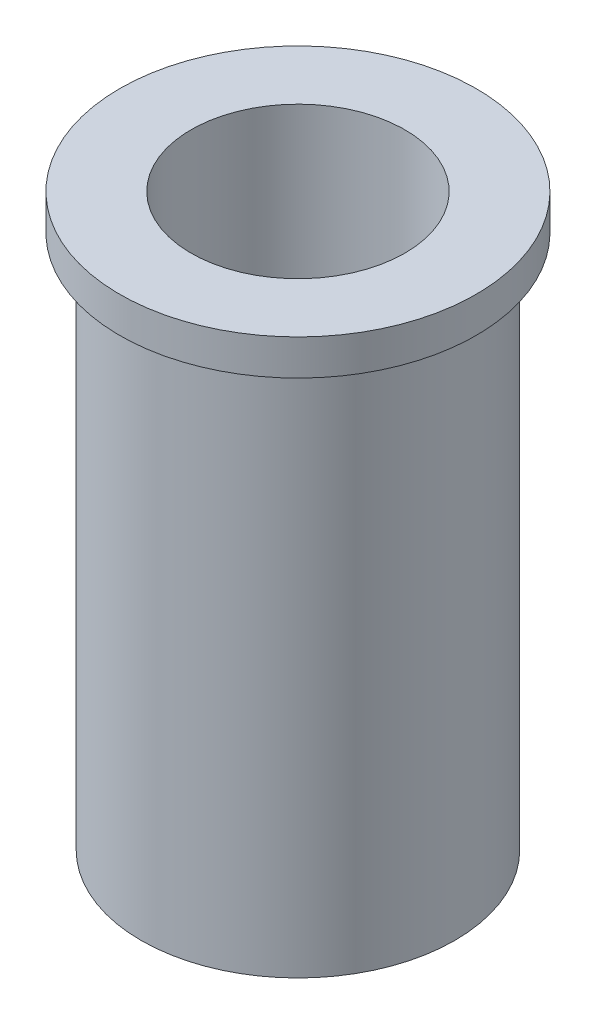
ISO-10303-21;
HEADER;
FILE_DESCRIPTION(('STEP AP214'),'2;1');
FILE_NAME('part.step','',(''),(''),'','','');
FILE_SCHEMA(('AUTOMOTIVE_DESIGN { 1 0 10303 214 1 1 1 1 }'));
ENDSEC;
DATA;
#1=APPLICATION_CONTEXT('core data for automotive mechanical design processes');
#2=APPLICATION_PROTOCOL_DEFINITION('international standard','automotive_design',2000,#1);
#3=PRODUCT_CONTEXT('',#1,'mechanical');
#4=PRODUCT('Part','Part','',(#3));
#5=PRODUCT_RELATED_PRODUCT_CATEGORY('part','',(#4));
#6=PRODUCT_DEFINITION_FORMATION('','',#4);
#7=PRODUCT_DEFINITION_CONTEXT('part definition',#1,'design');
#8=PRODUCT_DEFINITION('design','',#6,#7);
#9=PRODUCT_DEFINITION_SHAPE('','',#8);
#10=(LENGTH_UNIT() NAMED_UNIT(*) SI_UNIT(.MILLI.,.METRE.));
#11=(NAMED_UNIT(*) PLANE_ANGLE_UNIT() SI_UNIT($,.RADIAN.));
#12=(NAMED_UNIT(*) SI_UNIT($,.STERADIAN.) SOLID_ANGLE_UNIT());
#13=UNCERTAINTY_MEASURE_WITH_UNIT(LENGTH_MEASURE(1.E-05),#10,'distance_accuracy_value','');
#14=(GEOMETRIC_REPRESENTATION_CONTEXT(3) GLOBAL_UNCERTAINTY_ASSIGNED_CONTEXT((#13)) GLOBAL_UNIT_ASSIGNED_CONTEXT((#10,
#11,#12)) REPRESENTATION_CONTEXT('',''));
#15=CARTESIAN_POINT('',(0.,0.,0.));
#16=DIRECTION('',(0.,0.,1.));
#17=DIRECTION('',(1.,0.,0.));
#18=AXIS2_PLACEMENT_3D('',#15,#16,#17);
#19=CARTESIAN_POINT('',(0.,2.87205778568436,0.));
#20=DIRECTION('',(0.,1.,0.));
#21=DIRECTION('',(-1.,0.,0.));
#22=AXIS2_PLACEMENT_3D('',#19,#20,#21);
#23=CYLINDRICAL_SURFACE('',#22,5.);
#24=CARTESIAN_POINT('',(0.,1.87205778568436,0.));
#25=DIRECTION('',(0.,1.,0.));
#26=DIRECTION('',(-1.,0.,0.));
#27=AXIS2_PLACEMENT_3D('',#24,#25,#26);
#28=CIRCLE('',#27,5.);
#29=CARTESIAN_POINT('',(-5.,1.87205778568436,0.));
#30=VERTEX_POINT('',#29);
#31=EDGE_CURVE('E44',#30,#30,#28,.T.);
#32=ORIENTED_EDGE('',*,*,#31,.T.);
#33=EDGE_LOOP('',(#32));
#34=FACE_BOUND('',#33,.T.);
#35=CARTESIAN_POINT('',(0.,2.87205778568436,0.));
#36=DIRECTION('',(0.,1.,0.));
#37=DIRECTION('',(-1.,0.,0.));
#38=AXIS2_PLACEMENT_3D('',#35,#36,#37);
#39=CIRCLE('',#38,5.);
#40=CARTESIAN_POINT('',(-5.,2.87205778568436,0.));
#41=VERTEX_POINT('',#40);
#42=EDGE_CURVE('E10',#41,#41,#39,.T.);
#43=ORIENTED_EDGE('',*,*,#42,.F.);
#44=EDGE_LOOP('',(#43));
#45=FACE_BOUND('',#44,.T.);
#46=ADVANCED_FACE('F30',(#34,#45),#23,.T.);
#47=CARTESIAN_POINT('',(-5.,2.87205778568436,0.));
#48=DIRECTION('',(0.,1.,0.));
#49=DIRECTION('',(-1.,0.,0.));
#50=AXIS2_PLACEMENT_3D('',#47,#48,#49);
#51=PLANE('',#50);
#52=CARTESIAN_POINT('',(0.,2.87205778568436,0.));
#53=DIRECTION('',(0.,-1.,0.));
#54=DIRECTION('',(1.,0.,0.));
#55=AXIS2_PLACEMENT_3D('',#52,#53,#54);
#56=CIRCLE('',#55,3.);
#57=CARTESIAN_POINT('',(3.,2.87205778568436,0.));
#58=VERTEX_POINT('',#57);
#59=EDGE_CURVE('E49',#58,#58,#56,.T.);
#60=ORIENTED_EDGE('',*,*,#59,.T.);
#61=EDGE_LOOP('',(#60));
#62=FACE_BOUND('',#61,.T.);
#63=ORIENTED_EDGE('',*,*,#42,.T.);
#64=EDGE_LOOP('',(#63));
#65=FACE_BOUND('',#64,.T.);
#66=ADVANCED_FACE('F56',(#62,#65),#51,.T.);
#67=CARTESIAN_POINT('',(0.,-13.1279422143156,0.));
#68=DIRECTION('',(0.,-1.,0.));
#69=DIRECTION('',(1.,0.,0.));
#70=AXIS2_PLACEMENT_3D('',#67,#68,#69);
#71=PLANE('',#70);
#72=CARTESIAN_POINT('',(0.,-13.1279422143156,0.));
#73=DIRECTION('',(0.,-1.,0.));
#74=DIRECTION('',(1.,0.,0.));
#75=AXIS2_PLACEMENT_3D('',#72,#73,#74);
#76=CIRCLE('',#75,3.);
#77=CARTESIAN_POINT('',(3.,-13.1279422143156,0.));
#78=VERTEX_POINT('',#77);
#79=EDGE_CURVE('E50',#78,#78,#76,.T.);
#80=ORIENTED_EDGE('',*,*,#79,.F.);
#81=EDGE_LOOP('',(#80));
#82=FACE_BOUND('',#81,.T.);
#83=CARTESIAN_POINT('',(0.,-13.1279422143156,0.));
#84=DIRECTION('',(0.,1.,0.));
#85=DIRECTION('',(-1.,0.,0.));
#86=AXIS2_PLACEMENT_3D('',#83,#84,#85);
#87=CIRCLE('',#86,4.4);
#88=CARTESIAN_POINT('',(-4.4,-13.1279422143156,0.));
#89=VERTEX_POINT('',#88);
#90=EDGE_CURVE('E36',#89,#89,#87,.T.);
#91=ORIENTED_EDGE('',*,*,#90,.F.);
#92=EDGE_LOOP('',(#91));
#93=FACE_BOUND('',#92,.T.);
#94=ADVANCED_FACE('F65',(#82,#93),#71,.T.);
#95=CARTESIAN_POINT('',(0.,2.87205778568436,0.));
#96=DIRECTION('',(0.,1.,0.));
#97=DIRECTION('',(-1.,0.,0.));
#98=AXIS2_PLACEMENT_3D('',#95,#96,#97);
#99=CYLINDRICAL_SURFACE('',#98,4.4);
#100=ORIENTED_EDGE('',*,*,#90,.T.);
#101=EDGE_LOOP('',(#100));
#102=FACE_BOUND('',#101,.T.);
#103=CARTESIAN_POINT('',(0.,1.87205778568436,0.));
#104=DIRECTION('',(0.,1.,0.));
#105=DIRECTION('',(-1.,0.,0.));
#106=AXIS2_PLACEMENT_3D('',#103,#104,#105);
#107=CIRCLE('',#106,4.4);
#108=CARTESIAN_POINT('',(-4.4,1.87205778568436,0.));
#109=VERTEX_POINT('',#108);
#110=EDGE_CURVE('E40',#109,#109,#107,.T.);
#111=ORIENTED_EDGE('',*,*,#110,.F.);
#112=EDGE_LOOP('',(#111));
#113=FACE_BOUND('',#112,.T.);
#114=ADVANCED_FACE('F68',(#102,#113),#99,.T.);
#115=CARTESIAN_POINT('',(-4.4,1.87205778568436,0.));
#116=DIRECTION('',(0.,-1.,0.));
#117=DIRECTION('',(1.,0.,0.));
#118=AXIS2_PLACEMENT_3D('',#115,#116,#117);
#119=PLANE('',#118);
#120=ORIENTED_EDGE('',*,*,#110,.T.);
#121=EDGE_LOOP('',(#120));
#122=FACE_BOUND('',#121,.T.);
#123=ORIENTED_EDGE('',*,*,#31,.F.);
#124=EDGE_LOOP('',(#123));
#125=FACE_BOUND('',#124,.T.);
#126=ADVANCED_FACE('F61',(#122,#125),#119,.T.);
#127=CARTESIAN_POINT('',(0.,2.87205778568436,0.));
#128=DIRECTION('',(0.,-1.,0.));
#129=DIRECTION('',(1.,0.,0.));
#130=AXIS2_PLACEMENT_3D('',#127,#128,#129);
#131=CYLINDRICAL_SURFACE('',#130,3.);
#132=ORIENTED_EDGE('',*,*,#59,.F.);
#133=EDGE_LOOP('',(#132));
#134=FACE_BOUND('',#133,.T.);
#135=ORIENTED_EDGE('',*,*,#79,.T.);
#136=EDGE_LOOP('',(#135));
#137=FACE_BOUND('',#136,.T.);
#138=ADVANCED_FACE('F58',(#134,#137),#131,.F.);
#139=CLOSED_SHELL('',(#46,#66,#94,#114,#126,#138));
#140=MANIFOLD_SOLID_BREP('B2',#139);
#141=ADVANCED_BREP_SHAPE_REPRESENTATION('',(#18,#140),#14);
#142=SHAPE_DEFINITION_REPRESENTATION(#9,#141);
ENDSEC;
END-ISO-10303-21;
